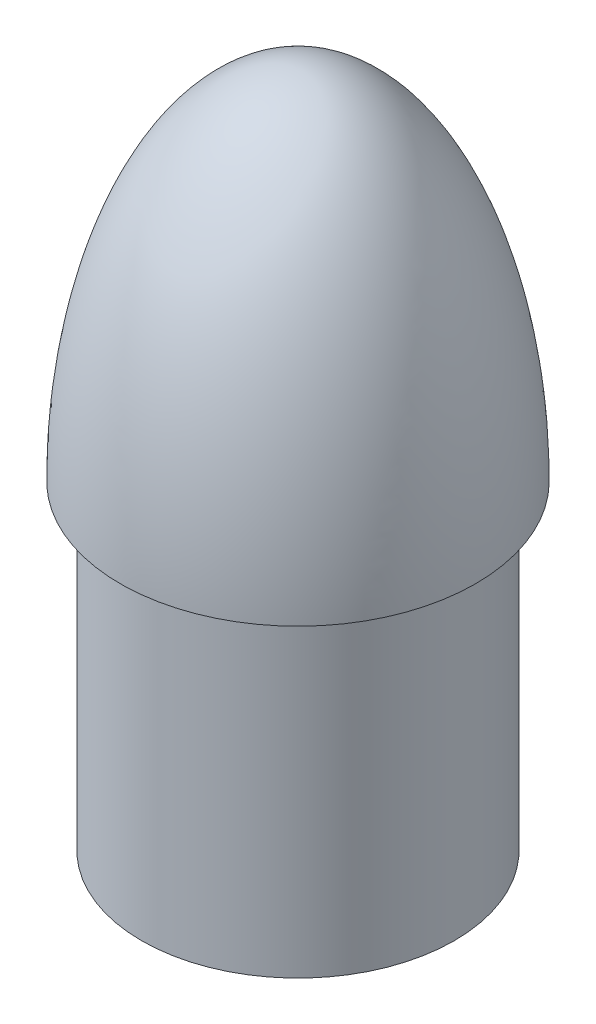
ISO-10303-21;
HEADER;
FILE_DESCRIPTION(('STEP AP214'),'2;1');
FILE_NAME('part.step','',(''),(''),'','','');
FILE_SCHEMA(('AUTOMOTIVE_DESIGN { 1 0 10303 214 1 1 1 1 }'));
ENDSEC;
DATA;
#1=APPLICATION_CONTEXT('core data for automotive mechanical design processes');
#2=APPLICATION_PROTOCOL_DEFINITION('international standard','automotive_design',2000,#1);
#3=PRODUCT_CONTEXT('',#1,'mechanical');
#4=PRODUCT('Part','Part','',(#3));
#5=PRODUCT_RELATED_PRODUCT_CATEGORY('part','',(#4));
#6=PRODUCT_DEFINITION_FORMATION('','',#4);
#7=PRODUCT_DEFINITION_CONTEXT('part definition',#1,'design');
#8=PRODUCT_DEFINITION('design','',#6,#7);
#9=PRODUCT_DEFINITION_SHAPE('','',#8);
#10=(LENGTH_UNIT() NAMED_UNIT(*) SI_UNIT(.MILLI.,.METRE.));
#11=(NAMED_UNIT(*) PLANE_ANGLE_UNIT() SI_UNIT($,.RADIAN.));
#12=(NAMED_UNIT(*) SI_UNIT($,.STERADIAN.) SOLID_ANGLE_UNIT());
#13=UNCERTAINTY_MEASURE_WITH_UNIT(LENGTH_MEASURE(1.E-05),#10,'distance_accuracy_value','');
#14=(GEOMETRIC_REPRESENTATION_CONTEXT(3) GLOBAL_UNCERTAINTY_ASSIGNED_CONTEXT((#13)) GLOBAL_UNIT_ASSIGNED_CONTEXT((#10,
#11,#12)) REPRESENTATION_CONTEXT('',''));
#15=CARTESIAN_POINT('',(0.,0.,0.));
#16=DIRECTION('',(0.,0.,1.));
#17=DIRECTION('',(1.,0.,0.));
#18=AXIS2_PLACEMENT_3D('',#15,#16,#17);
#19=CARTESIAN_POINT('',(22.,-45.,0.));
#20=DIRECTION('',(0.,-1.,0.));
#21=DIRECTION('',(1.,0.,0.));
#22=AXIS2_PLACEMENT_3D('',#19,#20,#21);
#23=PLANE('',#22);
#24=CARTESIAN_POINT('',(0.,-45.,0.));
#25=DIRECTION('',(0.,-1.,0.));
#26=DIRECTION('',(1.,0.,0.));
#27=AXIS2_PLACEMENT_3D('',#24,#25,#26);
#28=CIRCLE('',#27,22.);
#29=CARTESIAN_POINT('',(22.,-45.,0.));
#30=VERTEX_POINT('',#29);
#31=EDGE_CURVE('E11',#30,#30,#28,.T.);
#32=ORIENTED_EDGE('',*,*,#31,.T.);
#33=EDGE_LOOP('',(#32));
#34=FACE_BOUND('',#33,.T.);
#35=ADVANCED_FACE('F43',(#34),#23,.T.);
#36=CARTESIAN_POINT('',(0.,-45.,0.));
#37=DIRECTION('',(0.,-1.,0.));
#38=DIRECTION('',(1.,0.,0.));
#39=AXIS2_PLACEMENT_3D('',#36,#37,#38);
#40=CYLINDRICAL_SURFACE('',#39,22.);
#41=CARTESIAN_POINT('',(0.,0.,0.));
#42=DIRECTION('',(0.,-1.,0.));
#43=DIRECTION('',(1.,0.,0.));
#44=AXIS2_PLACEMENT_3D('',#41,#42,#43);
#45=CIRCLE('',#44,22.);
#46=CARTESIAN_POINT('',(22.,0.,0.));
#47=VERTEX_POINT('',#46);
#48=EDGE_CURVE('E49',#47,#47,#45,.T.);
#49=ORIENTED_EDGE('',*,*,#48,.T.);
#50=EDGE_LOOP('',(#49));
#51=FACE_BOUND('',#50,.T.);
#52=ORIENTED_EDGE('',*,*,#31,.F.);
#53=EDGE_LOOP('',(#52));
#54=FACE_BOUND('',#53,.T.);
#55=ADVANCED_FACE('F72',(#51,#54),#40,.T.);
#56=CARTESIAN_POINT('',(25.0000000024163,0.,0.));
#57=DIRECTION('',(0.,-1.,0.));
#58=DIRECTION('',(1.,0.,0.));
#59=AXIS2_PLACEMENT_3D('',#56,#57,#58);
#60=PLANE('',#59);
#61=CARTESIAN_POINT('',(0.,0.,0.));
#62=DIRECTION('',(0.,-1.,0.));
#63=DIRECTION('',(1.,0.,0.));
#64=AXIS2_PLACEMENT_3D('',#61,#62,#63);
#65=CIRCLE('',#64,25.0000000024163);
#66=CARTESIAN_POINT('',(25.0000000024163,0.,0.));
#67=VERTEX_POINT('',#66);
#68=EDGE_CURVE('E59',#67,#67,#65,.T.);
#69=ORIENTED_EDGE('',*,*,#68,.T.);
#70=EDGE_LOOP('',(#69));
#71=FACE_BOUND('',#70,.T.);
#72=ORIENTED_EDGE('',*,*,#48,.F.);
#73=EDGE_LOOP('',(#72));
#74=FACE_BOUND('',#73,.T.);
#75=ADVANCED_FACE('F55',(#71,#74),#60,.T.);
#76=CARTESIAN_POINT('',(25.0000000021143,6.04067145163776E-10,0.));
#77=CARTESIAN_POINT('',(25.0000000106951,0.926977799170088,0.));
#78=CARTESIAN_POINT('',(24.97696643963,2.79057557360373,0.));
#79=CARTESIAN_POINT('',(24.8726714978398,5.59234999864091,0.));
#80=CARTESIAN_POINT('',(24.5919908782039,9.32530951483483,0.));
#81=CARTESIAN_POINT('',(24.1645873340037,13.0570320931557,0.));
#82=CARTESIAN_POINT('',(23.585695772566,16.7713599985541,0.));
#83=CARTESIAN_POINT('',(22.8484067966359,20.4577630578963,0.));
#84=CARTESIAN_POINT('',(21.9429689294302,24.1067703422793,0.));
#85=CARTESIAN_POINT('',(20.8565347134237,27.7063876977455,0.));
#86=CARTESIAN_POINT('',(19.5723335268168,31.2407420896441,0.));
#87=CARTESIAN_POINT('',(18.0685786365863,34.6881681947021,0.));
#88=CARTESIAN_POINT('',(16.4576887766998,37.7501813350728,0.));
#89=CARTESIAN_POINT('',(14.8640261239163,40.2798977633798,0.));
#90=CARTESIAN_POINT('',(13.3639963125175,42.3031531889559,0.));
#91=CARTESIAN_POINT('',(12.0364760109931,43.8630367189261,0.));
#92=CARTESIAN_POINT('',(10.7228644557192,45.209159450027,0.));
#93=CARTESIAN_POINT('',(9.34399511240016,46.4185717455165,0.));
#94=CARTESIAN_POINT('',(7.99168848026022,47.4121460646178,0.));
#95=CARTESIAN_POINT('',(6.82687824699968,48.1211689920198,0.));
#96=CARTESIAN_POINT('',(5.89261660501343,48.6012289340466,0.));
#97=CARTESIAN_POINT('',(5.17906370977957,48.9215645386401,0.));
#98=CARTESIAN_POINT('',(4.59476959506994,49.1537223022953,0.));
#99=CARTESIAN_POINT('',(4.00763224897517,49.360434184026,0.));
#100=CARTESIAN_POINT('',(3.40020342076036,49.5404214441653,0.));
#101=CARTESIAN_POINT('',(2.65341371651376,49.7304990116544,0.));
#102=CARTESIAN_POINT('',(1.85924752322866,49.8722546560514,0.));
#103=CARTESIAN_POINT('',(1.11797897567837,49.9633812320449,0.));
#104=CARTESIAN_POINT('',(0.449901030255466,49.994768682292,0.));
#105=CARTESIAN_POINT('',(0.150346696954166,49.9999999988027,0.));
#106=CARTESIAN_POINT('',(-1.51019142666502E-09,49.9999999987918,0.));
#107=B_SPLINE_CURVE_WITH_KNOTS('',4,(#76,#77,#78,#79,#80,#81,#82,#83,#84,#85,#86,#87,#88,#89,
#90,#91,#92,#93,#94,#95,#96,#97,#98,#99,#100,#101,#102,#103,#104,#105,#106),.UNSPECIFIED.,.F.,
.F.,(5,1,1,1,1,1,1,1,1,1,1,1,1,1,1,1,1,1,1,1,1,1,1,1,1,1,1,5),(0.0399030982684692,
0.0986939838100788,0.158096481578385,0.217679161798947,0.27726539996581,0.336852487456706,
0.39644245004403,0.456031554217703,0.515621302658749,0.575210752842016,0.63480069828262,
0.694390311483119,0.734827889083893,0.76462273945626,0.794417780686445,0.824212689764753,
0.854007418808666,0.880820536057787,0.900683901983126,0.910615552408977,0.920547202834827,
0.930478804227449,0.940410405620071,0.950342005922373,0.960273606224675,0.98013677941534,
0.990068389722218,1.),.UNSPECIFIED.);
#108=CARTESIAN_POINT('',(0.,-45.,0.));
#109=DIRECTION('',(0.,-1.,0.));
#110=AXIS1_PLACEMENT('',#108,#109);
#111=SURFACE_OF_REVOLUTION('',#107,#110);
#112=CARTESIAN_POINT('',(-1.51019142666502E-09,49.9999999987918,0.));
#113=VERTEX_POINT('',#112);
#114=VERTEX_LOOP('',#113);
#115=FACE_BOUND('',#114,.T.);
#116=ORIENTED_EDGE('',*,*,#68,.F.);
#117=EDGE_LOOP('',(#116));
#118=FACE_BOUND('',#117,.T.);
#119=ADVANCED_FACE('F52',(#115,#118),#111,.F.);
#120=CLOSED_SHELL('',(#35,#55,#75,#119));
#121=MANIFOLD_SOLID_BREP('B2',#120);
#122=ADVANCED_BREP_SHAPE_REPRESENTATION('',(#18,#121),#14);
#123=SHAPE_DEFINITION_REPRESENTATION(#9,#122);
ENDSEC;
END-ISO-10303-21;
